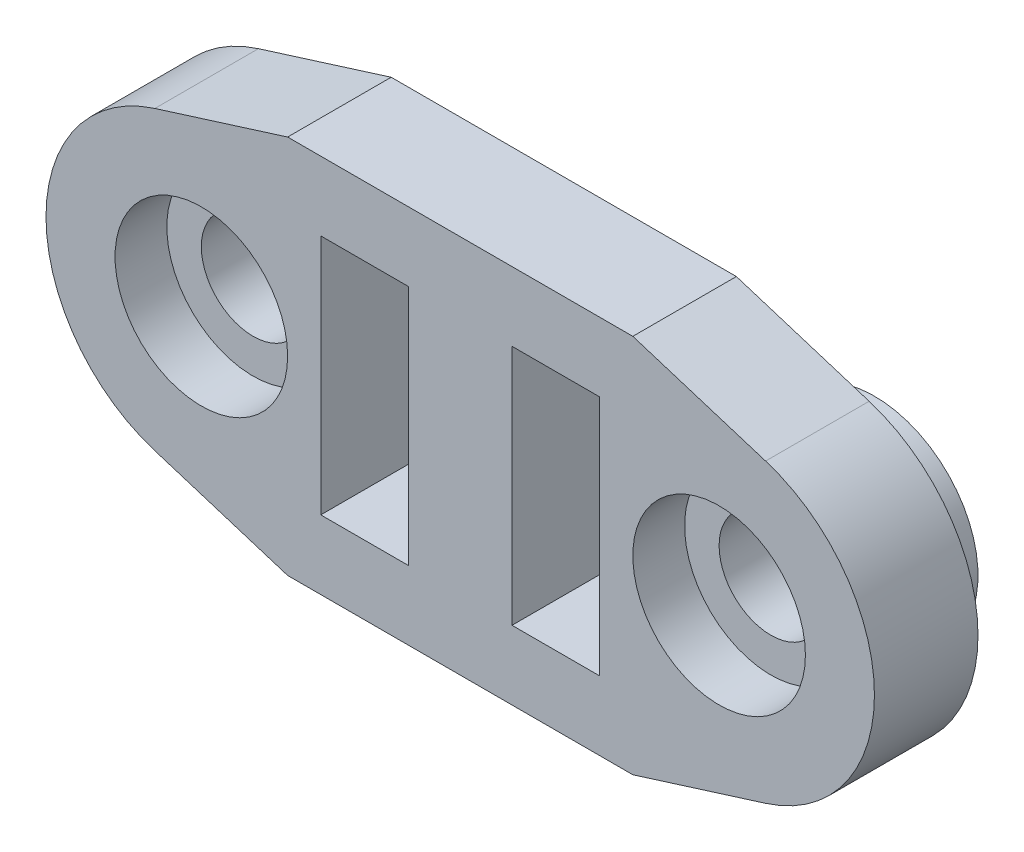
ISO-10303-21;
HEADER;
FILE_DESCRIPTION(('STEP AP214'),'2;1');
FILE_NAME('part.step','',(''),(''),'','','');
FILE_SCHEMA(('AUTOMOTIVE_DESIGN { 1 0 10303 214 1 1 1 1 }'));
ENDSEC;
DATA;
#1=APPLICATION_CONTEXT('core data for automotive mechanical design processes');
#2=APPLICATION_PROTOCOL_DEFINITION('international standard','automotive_design',2000,#1);
#3=PRODUCT_CONTEXT('',#1,'mechanical');
#4=PRODUCT('Part','Part','',(#3));
#5=PRODUCT_RELATED_PRODUCT_CATEGORY('part','',(#4));
#6=PRODUCT_DEFINITION_FORMATION('','',#4);
#7=PRODUCT_DEFINITION_CONTEXT('part definition',#1,'design');
#8=PRODUCT_DEFINITION('design','',#6,#7);
#9=PRODUCT_DEFINITION_SHAPE('','',#8);
#10=(LENGTH_UNIT() NAMED_UNIT(*) SI_UNIT(.MILLI.,.METRE.));
#11=(NAMED_UNIT(*) PLANE_ANGLE_UNIT() SI_UNIT($,.RADIAN.));
#12=(NAMED_UNIT(*) SI_UNIT($,.STERADIAN.) SOLID_ANGLE_UNIT());
#13=UNCERTAINTY_MEASURE_WITH_UNIT(LENGTH_MEASURE(1.E-05),#10,'distance_accuracy_value','');
#14=(GEOMETRIC_REPRESENTATION_CONTEXT(3) GLOBAL_UNCERTAINTY_ASSIGNED_CONTEXT((#13)) GLOBAL_UNIT_ASSIGNED_CONTEXT((#10,
#11,#12)) REPRESENTATION_CONTEXT('',''));
#15=CARTESIAN_POINT('',(0.,0.,0.));
#16=DIRECTION('',(0.,0.,1.));
#17=DIRECTION('',(1.,0.,0.));
#18=AXIS2_PLACEMENT_3D('',#15,#16,#17);
#19=CARTESIAN_POINT('',(7.5,0.,1.5));
#20=DIRECTION('',(0.,0.,-1.));
#21=DIRECTION('',(-1.,0.,0.));
#22=AXIS2_PLACEMENT_3D('',#19,#20,#21);
#23=CYLINDRICAL_SURFACE('',#22,1.5);
#24=CARTESIAN_POINT('',(7.5,0.,-3.));
#25=DIRECTION('',(0.,0.,-1.));
#26=DIRECTION('',(-1.,0.,0.));
#27=AXIS2_PLACEMENT_3D('',#24,#25,#26);
#28=CIRCLE('',#27,1.5);
#29=CARTESIAN_POINT('',(6.,0.,-3.));
#30=VERTEX_POINT('',#29);
#31=EDGE_CURVE('E277',#30,#30,#28,.T.);
#32=ORIENTED_EDGE('',*,*,#31,.T.);
#33=EDGE_LOOP('',(#32));
#34=FACE_BOUND('',#33,.T.);
#35=CARTESIAN_POINT('',(7.5,0.,0.));
#36=DIRECTION('',(0.,0.,1.));
#37=DIRECTION('',(1.,0.,0.));
#38=AXIS2_PLACEMENT_3D('',#35,#36,#37);
#39=CIRCLE('',#38,1.5);
#40=CARTESIAN_POINT('',(9.,0.,0.));
#41=VERTEX_POINT('',#40);
#42=EDGE_CURVE('E49',#41,#41,#39,.T.);
#43=ORIENTED_EDGE('',*,*,#42,.T.);
#44=EDGE_LOOP('',(#43));
#45=FACE_BOUND('',#44,.T.);
#46=ADVANCED_FACE('F45',(#34,#45),#23,.F.);
#47=CARTESIAN_POINT('',(-7.5,0.,1.5));
#48=DIRECTION('',(0.,0.,-1.));
#49=DIRECTION('',(-1.,0.,0.));
#50=AXIS2_PLACEMENT_3D('',#47,#48,#49);
#51=CYLINDRICAL_SURFACE('',#50,1.5);
#52=CARTESIAN_POINT('',(-7.5,0.,-3.));
#53=DIRECTION('',(0.,0.,-1.));
#54=DIRECTION('',(-1.,0.,0.));
#55=AXIS2_PLACEMENT_3D('',#52,#53,#54);
#56=CIRCLE('',#55,1.5);
#57=CARTESIAN_POINT('',(-9.,0.,-3.));
#58=VERTEX_POINT('',#57);
#59=EDGE_CURVE('E269',#58,#58,#56,.T.);
#60=ORIENTED_EDGE('',*,*,#59,.T.);
#61=EDGE_LOOP('',(#60));
#62=FACE_BOUND('',#61,.T.);
#63=CARTESIAN_POINT('',(-7.5,0.,0.));
#64=DIRECTION('',(0.,0.,1.));
#65=DIRECTION('',(1.,0.,0.));
#66=AXIS2_PLACEMENT_3D('',#63,#64,#65);
#67=CIRCLE('',#66,1.5);
#68=CARTESIAN_POINT('',(-6.,0.,0.));
#69=VERTEX_POINT('',#68);
#70=EDGE_CURVE('E253',#69,#69,#67,.T.);
#71=ORIENTED_EDGE('',*,*,#70,.T.);
#72=EDGE_LOOP('',(#71));
#73=FACE_BOUND('',#72,.T.);
#74=ADVANCED_FACE('F432',(#62,#73),#51,.F.);
#75=CARTESIAN_POINT('',(7.5,0.,-1.5));
#76=DIRECTION('',(0.,0.,-1.));
#77=DIRECTION('',(-1.,0.,0.));
#78=AXIS2_PLACEMENT_3D('',#75,#76,#77);
#79=PLANE('',#78);
#80=DIRECTION('',(0.,-1.,0.));
#81=VECTOR('',#80,1.);
#82=CARTESIAN_POINT('',(-1.5,0.,-1.5));
#83=LINE('',#82,#81);
#84=CARTESIAN_POINT('',(-1.5,3.5,-1.5));
#85=VERTEX_POINT('',#84);
#86=CARTESIAN_POINT('',(-1.5,-3.5,-1.5));
#87=VERTEX_POINT('',#86);
#88=EDGE_CURVE('E245',#85,#87,#83,.T.);
#89=ORIENTED_EDGE('',*,*,#88,.F.);
#90=DIRECTION('',(1.,0.,0.));
#91=VECTOR('',#90,1.);
#92=CARTESIAN_POINT('',(7.5,3.5,-1.5));
#93=LINE('',#92,#91);
#94=CARTESIAN_POINT('',(-4.04,3.5,-1.5));
#95=VERTEX_POINT('',#94);
#96=EDGE_CURVE('E237',#95,#85,#93,.T.);
#97=ORIENTED_EDGE('',*,*,#96,.F.);
#98=DIRECTION('',(0.,1.,0.));
#99=VECTOR('',#98,1.);
#100=CARTESIAN_POINT('',(-4.04,0.,-1.5));
#101=LINE('',#100,#99);
#102=CARTESIAN_POINT('',(-4.04,-3.5,-1.5));
#103=VERTEX_POINT('',#102);
#104=EDGE_CURVE('E166',#103,#95,#101,.T.);
#105=ORIENTED_EDGE('',*,*,#104,.F.);
#106=DIRECTION('',(-1.,0.,0.));
#107=VECTOR('',#106,1.);
#108=CARTESIAN_POINT('',(7.5,-3.5,-1.5));
#109=LINE('',#108,#107);
#110=EDGE_CURVE('E242',#87,#103,#109,.T.);
#111=ORIENTED_EDGE('',*,*,#110,.F.);
#112=EDGE_LOOP('',(#89,#97,#105,#111));
#113=FACE_BOUND('',#112,.T.);
#114=DIRECTION('',(0.,-1.,0.));
#115=VECTOR('',#114,1.);
#116=CARTESIAN_POINT('',(4.04,0.,-1.5));
#117=LINE('',#116,#115);
#118=CARTESIAN_POINT('',(4.04,3.5,-1.5));
#119=VERTEX_POINT('',#118);
#120=CARTESIAN_POINT('',(4.04,-3.5,-1.5));
#121=VERTEX_POINT('',#120);
#122=EDGE_CURVE('E234',#119,#121,#117,.T.);
#123=ORIENTED_EDGE('',*,*,#122,.F.);
#124=DIRECTION('',(1.,0.,0.));
#125=VECTOR('',#124,1.);
#126=CARTESIAN_POINT('',(7.5,3.5,-1.5));
#127=LINE('',#126,#125);
#128=CARTESIAN_POINT('',(1.5,3.5,-1.5));
#129=VERTEX_POINT('',#128);
#130=EDGE_CURVE('E195',#129,#119,#127,.T.);
#131=ORIENTED_EDGE('',*,*,#130,.F.);
#132=DIRECTION('',(0.,1.,0.));
#133=VECTOR('',#132,1.);
#134=CARTESIAN_POINT('',(1.5,0.,-1.5));
#135=LINE('',#134,#133);
#136=CARTESIAN_POINT('',(1.5,-3.5,-1.5));
#137=VERTEX_POINT('',#136);
#138=EDGE_CURVE('E228',#137,#129,#135,.T.);
#139=ORIENTED_EDGE('',*,*,#138,.F.);
#140=DIRECTION('',(-1.,0.,0.));
#141=VECTOR('',#140,1.);
#142=CARTESIAN_POINT('',(7.5,-3.5,-1.5));
#143=LINE('',#142,#141);
#144=EDGE_CURVE('E231',#121,#137,#143,.T.);
#145=ORIENTED_EDGE('',*,*,#144,.F.);
#146=EDGE_LOOP('',(#123,#131,#139,#145));
#147=FACE_BOUND('',#146,.T.);
#148=CARTESIAN_POINT('',(7.5,0.,-1.5));
#149=DIRECTION('',(0.,0.,-1.));
#150=DIRECTION('',(-1.,0.,0.));
#151=AXIS2_PLACEMENT_3D('',#148,#149,#150);
#152=CIRCLE('',#151,3.);
#153=CARTESIAN_POINT('',(4.5,0.,-1.5));
#154=VERTEX_POINT('',#153);
#155=EDGE_CURVE('E281',#154,#154,#152,.T.);
#156=ORIENTED_EDGE('',*,*,#155,.F.);
#157=EDGE_LOOP('',(#156));
#158=FACE_BOUND('',#157,.T.);
#159=DIRECTION('',(-0.954186909188307,-0.299211200214274,0.));
#160=VECTOR('',#159,1.);
#161=CARTESIAN_POINT('',(-8.84645040096423,4.29384109134738,-1.5));
#162=LINE('',#161,#160);
#163=CARTESIAN_POINT('',(-5.,5.5,-1.5));
#164=VERTEX_POINT('',#163);
#165=CARTESIAN_POINT('',(-8.84645040096424,4.29384109134738,-1.5));
#166=VERTEX_POINT('',#165);
#167=EDGE_CURVE('E286',#164,#166,#162,.T.);
#168=ORIENTED_EDGE('',*,*,#167,.F.);
#169=DIRECTION('',(-1.,0.,0.));
#170=VECTOR('',#169,1.);
#171=CARTESIAN_POINT('',(-5.,5.5,-1.5));
#172=LINE('',#171,#170);
#173=CARTESIAN_POINT('',(5.,5.5,-1.5));
#174=VERTEX_POINT('',#173);
#175=EDGE_CURVE('E295',#174,#164,#172,.T.);
#176=ORIENTED_EDGE('',*,*,#175,.F.);
#177=DIRECTION('',(-0.954186909188307,0.299211200214274,0.));
#178=VECTOR('',#177,1.);
#179=CARTESIAN_POINT('',(5.,5.5,-1.5));
#180=LINE('',#179,#178);
#181=CARTESIAN_POINT('',(8.84645040096424,4.29384109134738,-1.5));
#182=VERTEX_POINT('',#181);
#183=EDGE_CURVE('E335',#182,#174,#180,.T.);
#184=ORIENTED_EDGE('',*,*,#183,.F.);
#185=CARTESIAN_POINT('',(7.5,0.,-1.5));
#186=DIRECTION('',(0.,0.,1.));
#187=DIRECTION('',(-1.,0.,0.));
#188=AXIS2_PLACEMENT_3D('',#185,#186,#187);
#189=CIRCLE('',#188,4.5);
#190=CARTESIAN_POINT('',(8.84645040096423,-4.29384109134738,-1.5));
#191=VERTEX_POINT('',#190);
#192=EDGE_CURVE('E332',#191,#182,#189,.T.);
#193=ORIENTED_EDGE('',*,*,#192,.F.);
#194=DIRECTION('',(0.954186909188307,0.299211200214274,0.));
#195=VECTOR('',#194,1.);
#196=CARTESIAN_POINT('',(8.84645040096424,-4.29384109134738,-1.5));
#197=LINE('',#196,#195);
#198=CARTESIAN_POINT('',(5.,-5.5,-1.5));
#199=VERTEX_POINT('',#198);
#200=EDGE_CURVE('E329',#199,#191,#197,.T.);
#201=ORIENTED_EDGE('',*,*,#200,.F.);
#202=DIRECTION('',(1.,0.,0.));
#203=VECTOR('',#202,1.);
#204=CARTESIAN_POINT('',(5.,-5.5,-1.5));
#205=LINE('',#204,#203);
#206=CARTESIAN_POINT('',(-5.,-5.5,-1.5));
#207=VERTEX_POINT('',#206);
#208=EDGE_CURVE('E326',#207,#199,#205,.T.);
#209=ORIENTED_EDGE('',*,*,#208,.F.);
#210=DIRECTION('',(0.954186909188307,-0.299211200214274,0.));
#211=VECTOR('',#210,1.);
#212=CARTESIAN_POINT('',(-5.,-5.5,-1.5));
#213=LINE('',#212,#211);
#214=CARTESIAN_POINT('',(-8.84645040096423,-4.29384109134738,-1.5));
#215=VERTEX_POINT('',#214);
#216=EDGE_CURVE('E323',#215,#207,#213,.T.);
#217=ORIENTED_EDGE('',*,*,#216,.F.);
#218=CARTESIAN_POINT('',(-7.5,0.,-1.5));
#219=DIRECTION('',(0.,0.,1.));
#220=DIRECTION('',(-1.,0.,0.));
#221=AXIS2_PLACEMENT_3D('',#218,#219,#220);
#222=CIRCLE('',#221,4.5);
#223=EDGE_CURVE('E320',#166,#215,#222,.T.);
#224=ORIENTED_EDGE('',*,*,#223,.F.);
#225=EDGE_LOOP('',(#168,#176,#184,#193,#201,#209,#217,#224));
#226=FACE_BOUND('',#225,.T.);
#227=CARTESIAN_POINT('',(-7.5,0.,-1.5));
#228=DIRECTION('',(0.,0.,-1.));
#229=DIRECTION('',(-1.,0.,0.));
#230=AXIS2_PLACEMENT_3D('',#227,#228,#229);
#231=CIRCLE('',#230,3.);
#232=CARTESIAN_POINT('',(-10.5,0.,-1.5));
#233=VERTEX_POINT('',#232);
#234=EDGE_CURVE('E265',#233,#233,#231,.T.);
#235=ORIENTED_EDGE('',*,*,#234,.F.);
#236=EDGE_LOOP('',(#235));
#237=FACE_BOUND('',#236,.T.);
#238=ADVANCED_FACE('F390',(#113,#147,#158,#226,#237),#79,.T.);
#239=CARTESIAN_POINT('',(7.5,0.,1.5));
#240=DIRECTION('',(0.,0.,-1.));
#241=DIRECTION('',(-1.,0.,0.));
#242=AXIS2_PLACEMENT_3D('',#239,#240,#241);
#243=PLANE('',#242);
#244=DIRECTION('',(-1.,0.,0.));
#245=VECTOR('',#244,1.);
#246=CARTESIAN_POINT('',(-4.04,3.5,1.5));
#247=LINE('',#246,#245);
#248=CARTESIAN_POINT('',(-1.5,3.5,1.5));
#249=VERTEX_POINT('',#248);
#250=CARTESIAN_POINT('',(-4.04,3.5,1.5));
#251=VERTEX_POINT('',#250);
#252=EDGE_CURVE('E174',#249,#251,#247,.T.);
#253=ORIENTED_EDGE('',*,*,#252,.F.);
#254=DIRECTION('',(0.,1.,0.));
#255=VECTOR('',#254,1.);
#256=CARTESIAN_POINT('',(-1.5,-3.5,1.5));
#257=LINE('',#256,#255);
#258=CARTESIAN_POINT('',(-1.5,-3.5,1.5));
#259=VERTEX_POINT('',#258);
#260=EDGE_CURVE('E180',#259,#249,#257,.T.);
#261=ORIENTED_EDGE('',*,*,#260,.F.);
#262=DIRECTION('',(1.,0.,0.));
#263=VECTOR('',#262,1.);
#264=CARTESIAN_POINT('',(-4.04,-3.5,1.5));
#265=LINE('',#264,#263);
#266=CARTESIAN_POINT('',(-4.04,-3.5,1.5));
#267=VERTEX_POINT('',#266);
#268=EDGE_CURVE('E185',#267,#259,#265,.T.);
#269=ORIENTED_EDGE('',*,*,#268,.F.);
#270=DIRECTION('',(0.,-1.,0.));
#271=VECTOR('',#270,1.);
#272=CARTESIAN_POINT('',(-4.04,-3.5,1.5));
#273=LINE('',#272,#271);
#274=EDGE_CURVE('E163',#251,#267,#273,.T.);
#275=ORIENTED_EDGE('',*,*,#274,.F.);
#276=EDGE_LOOP('',(#253,#261,#269,#275));
#277=FACE_BOUND('',#276,.T.);
#278=DIRECTION('',(-1.,0.,0.));
#279=VECTOR('',#278,1.);
#280=CARTESIAN_POINT('',(1.5,3.5,1.5));
#281=LINE('',#280,#279);
#282=CARTESIAN_POINT('',(4.04,3.5,1.5));
#283=VERTEX_POINT('',#282);
#284=CARTESIAN_POINT('',(1.5,3.5,1.5));
#285=VERTEX_POINT('',#284);
#286=EDGE_CURVE('E220',#283,#285,#281,.T.);
#287=ORIENTED_EDGE('',*,*,#286,.F.);
#288=DIRECTION('',(0.,1.,0.));
#289=VECTOR('',#288,1.);
#290=CARTESIAN_POINT('',(4.04,-3.5,1.5));
#291=LINE('',#290,#289);
#292=CARTESIAN_POINT('',(4.04,-3.5,1.5));
#293=VERTEX_POINT('',#292);
#294=EDGE_CURVE('E223',#293,#283,#291,.T.);
#295=ORIENTED_EDGE('',*,*,#294,.F.);
#296=DIRECTION('',(1.,0.,0.));
#297=VECTOR('',#296,1.);
#298=CARTESIAN_POINT('',(1.5,-3.5,1.5));
#299=LINE('',#298,#297);
#300=CARTESIAN_POINT('',(1.5,-3.5,1.5));
#301=VERTEX_POINT('',#300);
#302=EDGE_CURVE('E204',#301,#293,#299,.T.);
#303=ORIENTED_EDGE('',*,*,#302,.F.);
#304=DIRECTION('',(0.,-1.,0.));
#305=VECTOR('',#304,1.);
#306=CARTESIAN_POINT('',(1.5,-3.5,1.5));
#307=LINE('',#306,#305);
#308=EDGE_CURVE('E216',#285,#301,#307,.T.);
#309=ORIENTED_EDGE('',*,*,#308,.F.);
#310=EDGE_LOOP('',(#287,#295,#303,#309));
#311=FACE_BOUND('',#310,.T.);
#312=CARTESIAN_POINT('',(-7.5,0.,1.5));
#313=DIRECTION('',(0.,0.,1.));
#314=DIRECTION('',(1.,0.,0.));
#315=AXIS2_PLACEMENT_3D('',#312,#313,#314);
#316=CIRCLE('',#315,2.5);
#317=CARTESIAN_POINT('',(-5.,0.,1.5));
#318=VERTEX_POINT('',#317);
#319=EDGE_CURVE('E254',#318,#318,#316,.T.);
#320=ORIENTED_EDGE('',*,*,#319,.F.);
#321=EDGE_LOOP('',(#320));
#322=FACE_BOUND('',#321,.T.);
#323=CARTESIAN_POINT('',(7.5,0.,1.5));
#324=DIRECTION('',(0.,0.,1.));
#325=DIRECTION('',(1.,0.,0.));
#326=AXIS2_PLACEMENT_3D('',#323,#324,#325);
#327=CIRCLE('',#326,2.5);
#328=CARTESIAN_POINT('',(10.,0.,1.5));
#329=VERTEX_POINT('',#328);
#330=EDGE_CURVE('E258',#329,#329,#327,.T.);
#331=ORIENTED_EDGE('',*,*,#330,.F.);
#332=EDGE_LOOP('',(#331));
#333=FACE_BOUND('',#332,.T.);
#334=DIRECTION('',(-0.954186909188307,-0.299211200214274,0.));
#335=VECTOR('',#334,1.);
#336=CARTESIAN_POINT('',(-8.84645040096423,4.29384109134738,1.5));
#337=LINE('',#336,#335);
#338=CARTESIAN_POINT('',(-5.,5.5,1.5));
#339=VERTEX_POINT('',#338);
#340=CARTESIAN_POINT('',(-8.84645040096424,4.29384109134738,1.5));
#341=VERTEX_POINT('',#340);
#342=EDGE_CURVE('E290',#339,#341,#337,.T.);
#343=ORIENTED_EDGE('',*,*,#342,.T.);
#344=CARTESIAN_POINT('',(-7.5,0.,1.5));
#345=DIRECTION('',(0.,0.,1.));
#346=DIRECTION('',(-1.,0.,0.));
#347=AXIS2_PLACEMENT_3D('',#344,#345,#346);
#348=CIRCLE('',#347,4.5);
#349=CARTESIAN_POINT('',(-8.84645040096423,-4.29384109134738,1.5));
#350=VERTEX_POINT('',#349);
#351=EDGE_CURVE('E294',#341,#350,#348,.T.);
#352=ORIENTED_EDGE('',*,*,#351,.T.);
#353=DIRECTION('',(0.954186909188307,-0.299211200214274,0.));
#354=VECTOR('',#353,1.);
#355=CARTESIAN_POINT('',(-5.,-5.5,1.5));
#356=LINE('',#355,#354);
#357=CARTESIAN_POINT('',(-5.,-5.5,1.5));
#358=VERTEX_POINT('',#357);
#359=EDGE_CURVE('E298',#350,#358,#356,.T.);
#360=ORIENTED_EDGE('',*,*,#359,.T.);
#361=DIRECTION('',(1.,0.,0.));
#362=VECTOR('',#361,1.);
#363=CARTESIAN_POINT('',(5.,-5.5,1.5));
#364=LINE('',#363,#362);
#365=CARTESIAN_POINT('',(5.,-5.5,1.5));
#366=VERTEX_POINT('',#365);
#367=EDGE_CURVE('E301',#358,#366,#364,.T.);
#368=ORIENTED_EDGE('',*,*,#367,.T.);
#369=DIRECTION('',(0.954186909188307,0.299211200214274,0.));
#370=VECTOR('',#369,1.);
#371=CARTESIAN_POINT('',(8.84645040096424,-4.29384109134738,1.5));
#372=LINE('',#371,#370);
#373=CARTESIAN_POINT('',(8.84645040096423,-4.29384109134738,1.5));
#374=VERTEX_POINT('',#373);
#375=EDGE_CURVE('E304',#366,#374,#372,.T.);
#376=ORIENTED_EDGE('',*,*,#375,.T.);
#377=CARTESIAN_POINT('',(7.5,0.,1.5));
#378=DIRECTION('',(0.,0.,1.));
#379=DIRECTION('',(-1.,0.,0.));
#380=AXIS2_PLACEMENT_3D('',#377,#378,#379);
#381=CIRCLE('',#380,4.5);
#382=CARTESIAN_POINT('',(8.84645040096424,4.29384109134738,1.5));
#383=VERTEX_POINT('',#382);
#384=EDGE_CURVE('E307',#374,#383,#381,.T.);
#385=ORIENTED_EDGE('',*,*,#384,.T.);
#386=DIRECTION('',(-0.954186909188307,0.299211200214274,0.));
#387=VECTOR('',#386,1.);
#388=CARTESIAN_POINT('',(5.,5.5,1.5));
#389=LINE('',#388,#387);
#390=CARTESIAN_POINT('',(5.,5.5,1.5));
#391=VERTEX_POINT('',#390);
#392=EDGE_CURVE('E310',#383,#391,#389,.T.);
#393=ORIENTED_EDGE('',*,*,#392,.T.);
#394=DIRECTION('',(-1.,0.,0.));
#395=VECTOR('',#394,1.);
#396=CARTESIAN_POINT('',(-5.,5.5,1.5));
#397=LINE('',#396,#395);
#398=EDGE_CURVE('E313',#391,#339,#397,.T.);
#399=ORIENTED_EDGE('',*,*,#398,.T.);
#400=EDGE_LOOP('',(#343,#352,#360,#368,#376,#385,#393,#399));
#401=FACE_BOUND('',#400,.T.);
#402=ADVANCED_FACE('F182',(#277,#311,#322,#333,#401),#243,.F.);
#403=CARTESIAN_POINT('',(-8.84645040096423,4.29384109134738,1.5));
#404=DIRECTION('',(0.299211200214274,-0.954186909188306,0.));
#405=DIRECTION('',(0.954186909188307,0.299211200214274,0.));
#406=AXIS2_PLACEMENT_3D('',#403,#404,#405);
#407=PLANE('',#406);
#408=ORIENTED_EDGE('',*,*,#167,.T.);
#409=DIRECTION('',(0.,0.,-1.));
#410=VECTOR('',#409,1.);
#411=CARTESIAN_POINT('',(-8.84645040096424,4.29384109134738,1.5));
#412=LINE('',#411,#410);
#413=EDGE_CURVE('E11',#341,#166,#412,.T.);
#414=ORIENTED_EDGE('',*,*,#413,.F.);
#415=ORIENTED_EDGE('',*,*,#342,.F.);
#416=DIRECTION('',(0.,0.,-1.));
#417=VECTOR('',#416,1.);
#418=CARTESIAN_POINT('',(-5.,5.5,1.5));
#419=LINE('',#418,#417);
#420=EDGE_CURVE('E316',#339,#164,#419,.T.);
#421=ORIENTED_EDGE('',*,*,#420,.T.);
#422=EDGE_LOOP('',(#408,#414,#415,#421));
#423=FACE_BOUND('',#422,.T.);
#424=ADVANCED_FACE('F47',(#423),#407,.F.);
#425=CARTESIAN_POINT('',(-7.5,0.,1.5));
#426=DIRECTION('',(0.,0.,-1.));
#427=DIRECTION('',(-1.,0.,0.));
#428=AXIS2_PLACEMENT_3D('',#425,#426,#427);
#429=CYLINDRICAL_SURFACE('',#428,4.5);
#430=ORIENTED_EDGE('',*,*,#223,.T.);
#431=DIRECTION('',(0.,0.,-1.));
#432=VECTOR('',#431,1.);
#433=CARTESIAN_POINT('',(-8.84645040096423,-4.29384109134738,1.5));
#434=LINE('',#433,#432);
#435=EDGE_CURVE('E55',#350,#215,#434,.T.);
#436=ORIENTED_EDGE('',*,*,#435,.F.);
#437=ORIENTED_EDGE('',*,*,#351,.F.);
#438=ORIENTED_EDGE('',*,*,#413,.T.);
#439=EDGE_LOOP('',(#430,#436,#437,#438));
#440=FACE_BOUND('',#439,.T.);
#441=ADVANCED_FACE('F400',(#440),#429,.T.);
#442=CARTESIAN_POINT('',(-5.,-5.5,1.5));
#443=DIRECTION('',(0.299211200214274,0.954186909188306,0.));
#444=DIRECTION('',(-0.954186909188307,0.299211200214274,0.));
#445=AXIS2_PLACEMENT_3D('',#442,#443,#444);
#446=PLANE('',#445);
#447=ORIENTED_EDGE('',*,*,#216,.T.);
#448=DIRECTION('',(0.,0.,-1.));
#449=VECTOR('',#448,1.);
#450=CARTESIAN_POINT('',(-5.,-5.5,1.5));
#451=LINE('',#450,#449);
#452=EDGE_CURVE('E359',#358,#207,#451,.T.);
#453=ORIENTED_EDGE('',*,*,#452,.F.);
#454=ORIENTED_EDGE('',*,*,#359,.F.);
#455=ORIENTED_EDGE('',*,*,#435,.T.);
#456=EDGE_LOOP('',(#447,#453,#454,#455));
#457=FACE_BOUND('',#456,.T.);
#458=ADVANCED_FACE('F405',(#457),#446,.F.);
#459=CARTESIAN_POINT('',(5.,-5.5,1.5));
#460=DIRECTION('',(0.,1.,0.));
#461=DIRECTION('',(0.,0.,1.));
#462=AXIS2_PLACEMENT_3D('',#459,#460,#461);
#463=PLANE('',#462);
#464=ORIENTED_EDGE('',*,*,#208,.T.);
#465=DIRECTION('',(0.,0.,-1.));
#466=VECTOR('',#465,1.);
#467=CARTESIAN_POINT('',(5.,-5.5,1.5));
#468=LINE('',#467,#466);
#469=EDGE_CURVE('E355',#366,#199,#468,.T.);
#470=ORIENTED_EDGE('',*,*,#469,.F.);
#471=ORIENTED_EDGE('',*,*,#367,.F.);
#472=ORIENTED_EDGE('',*,*,#452,.T.);
#473=EDGE_LOOP('',(#464,#470,#471,#472));
#474=FACE_BOUND('',#473,.T.);
#475=ADVANCED_FACE('F411',(#474),#463,.F.);
#476=CARTESIAN_POINT('',(8.84645040096424,-4.29384109134738,1.5));
#477=DIRECTION('',(-0.299211200214274,0.954186909188307,0.));
#478=DIRECTION('',(-0.954186909188307,-0.299211200214274,0.));
#479=AXIS2_PLACEMENT_3D('',#476,#477,#478);
#480=PLANE('',#479);
#481=ORIENTED_EDGE('',*,*,#200,.T.);
#482=DIRECTION('',(0.,0.,-1.));
#483=VECTOR('',#482,1.);
#484=CARTESIAN_POINT('',(8.84645040096423,-4.29384109134738,1.5));
#485=LINE('',#484,#483);
#486=EDGE_CURVE('E351',#374,#191,#485,.T.);
#487=ORIENTED_EDGE('',*,*,#486,.F.);
#488=ORIENTED_EDGE('',*,*,#375,.F.);
#489=ORIENTED_EDGE('',*,*,#469,.T.);
#490=EDGE_LOOP('',(#481,#487,#488,#489));
#491=FACE_BOUND('',#490,.T.);
#492=ADVANCED_FACE('F415',(#491),#480,.F.);
#493=CARTESIAN_POINT('',(7.5,0.,1.5));
#494=DIRECTION('',(0.,0.,-1.));
#495=DIRECTION('',(-1.,0.,0.));
#496=AXIS2_PLACEMENT_3D('',#493,#494,#495);
#497=CYLINDRICAL_SURFACE('',#496,4.5);
#498=ORIENTED_EDGE('',*,*,#192,.T.);
#499=DIRECTION('',(0.,0.,-1.));
#500=VECTOR('',#499,1.);
#501=CARTESIAN_POINT('',(8.84645040096424,4.29384109134738,1.5));
#502=LINE('',#501,#500);
#503=EDGE_CURVE('E347',#383,#182,#502,.T.);
#504=ORIENTED_EDGE('',*,*,#503,.F.);
#505=ORIENTED_EDGE('',*,*,#384,.F.);
#506=ORIENTED_EDGE('',*,*,#486,.T.);
#507=EDGE_LOOP('',(#498,#504,#505,#506));
#508=FACE_BOUND('',#507,.T.);
#509=ADVANCED_FACE('F420',(#508),#497,.T.);
#510=CARTESIAN_POINT('',(5.,5.5,1.5));
#511=DIRECTION('',(-0.299211200214274,-0.954186909188307,0.));
#512=DIRECTION('',(0.954186909188307,-0.299211200214274,0.));
#513=AXIS2_PLACEMENT_3D('',#510,#511,#512);
#514=PLANE('',#513);
#515=ORIENTED_EDGE('',*,*,#183,.T.);
#516=DIRECTION('',(0.,0.,-1.));
#517=VECTOR('',#516,1.);
#518=CARTESIAN_POINT('',(5.,5.5,1.5));
#519=LINE('',#518,#517);
#520=EDGE_CURVE('E343',#391,#174,#519,.T.);
#521=ORIENTED_EDGE('',*,*,#520,.F.);
#522=ORIENTED_EDGE('',*,*,#392,.F.);
#523=ORIENTED_EDGE('',*,*,#503,.T.);
#524=EDGE_LOOP('',(#515,#521,#522,#523));
#525=FACE_BOUND('',#524,.T.);
#526=ADVANCED_FACE('F424',(#525),#514,.F.);
#527=CARTESIAN_POINT('',(-5.,5.5,1.5));
#528=DIRECTION('',(0.,-1.,0.));
#529=DIRECTION('',(0.,0.,-1.));
#530=AXIS2_PLACEMENT_3D('',#527,#528,#529);
#531=PLANE('',#530);
#532=ORIENTED_EDGE('',*,*,#175,.T.);
#533=ORIENTED_EDGE('',*,*,#420,.F.);
#534=ORIENTED_EDGE('',*,*,#398,.F.);
#535=ORIENTED_EDGE('',*,*,#520,.T.);
#536=EDGE_LOOP('',(#532,#533,#534,#535));
#537=FACE_BOUND('',#536,.T.);
#538=ADVANCED_FACE('F428',(#537),#531,.F.);
#539=CARTESIAN_POINT('',(7.5,0.,-3.));
#540=DIRECTION('',(0.,0.,-1.));
#541=DIRECTION('',(-1.,0.,0.));
#542=AXIS2_PLACEMENT_3D('',#539,#540,#541);
#543=PLANE('',#542);
#544=CARTESIAN_POINT('',(7.5,0.,-3.));
#545=DIRECTION('',(0.,0.,-1.));
#546=DIRECTION('',(-1.,0.,0.));
#547=AXIS2_PLACEMENT_3D('',#544,#545,#546);
#548=CIRCLE('',#547,3.);
#549=CARTESIAN_POINT('',(4.5,0.,-3.));
#550=VERTEX_POINT('',#549);
#551=EDGE_CURVE('E282',#550,#550,#548,.T.);
#552=ORIENTED_EDGE('',*,*,#551,.T.);
#553=EDGE_LOOP('',(#552));
#554=FACE_BOUND('',#553,.T.);
#555=ORIENTED_EDGE('',*,*,#31,.F.);
#556=EDGE_LOOP('',(#555));
#557=FACE_BOUND('',#556,.T.);
#558=ADVANCED_FACE('F465',(#554,#557),#543,.T.);
#559=CARTESIAN_POINT('',(7.5,0.,-3.));
#560=DIRECTION('',(0.,0.,1.));
#561=DIRECTION('',(1.,0.,0.));
#562=AXIS2_PLACEMENT_3D('',#559,#560,#561);
#563=CYLINDRICAL_SURFACE('',#562,3.);
#564=ORIENTED_EDGE('',*,*,#551,.F.);
#565=EDGE_LOOP('',(#564));
#566=FACE_BOUND('',#565,.T.);
#567=ORIENTED_EDGE('',*,*,#155,.T.);
#568=EDGE_LOOP('',(#567));
#569=FACE_BOUND('',#568,.T.);
#570=ADVANCED_FACE('F450',(#566,#569),#563,.T.);
#571=CARTESIAN_POINT('',(-7.5,0.,-3.));
#572=DIRECTION('',(0.,0.,-1.));
#573=DIRECTION('',(-1.,0.,0.));
#574=AXIS2_PLACEMENT_3D('',#571,#572,#573);
#575=PLANE('',#574);
#576=CARTESIAN_POINT('',(-7.5,0.,-3.));
#577=DIRECTION('',(0.,0.,-1.));
#578=DIRECTION('',(-1.,0.,0.));
#579=AXIS2_PLACEMENT_3D('',#576,#577,#578);
#580=CIRCLE('',#579,3.);
#581=CARTESIAN_POINT('',(-10.5,0.,-3.));
#582=VERTEX_POINT('',#581);
#583=EDGE_CURVE('E270',#582,#582,#580,.T.);
#584=ORIENTED_EDGE('',*,*,#583,.T.);
#585=EDGE_LOOP('',(#584));
#586=FACE_BOUND('',#585,.T.);
#587=ORIENTED_EDGE('',*,*,#59,.F.);
#588=EDGE_LOOP('',(#587));
#589=FACE_BOUND('',#588,.T.);
#590=ADVANCED_FACE('F440',(#586,#589),#575,.T.);
#591=CARTESIAN_POINT('',(-7.5,0.,-3.));
#592=DIRECTION('',(0.,0.,1.));
#593=DIRECTION('',(1.,0.,0.));
#594=AXIS2_PLACEMENT_3D('',#591,#592,#593);
#595=CYLINDRICAL_SURFACE('',#594,3.);
#596=ORIENTED_EDGE('',*,*,#583,.F.);
#597=EDGE_LOOP('',(#596));
#598=FACE_BOUND('',#597,.T.);
#599=ORIENTED_EDGE('',*,*,#234,.T.);
#600=EDGE_LOOP('',(#599));
#601=FACE_BOUND('',#600,.T.);
#602=ADVANCED_FACE('F437',(#598,#601),#595,.T.);
#603=CARTESIAN_POINT('',(-7.5,0.,0.));
#604=DIRECTION('',(0.,0.,1.));
#605=DIRECTION('',(1.,0.,0.));
#606=AXIS2_PLACEMENT_3D('',#603,#604,#605);
#607=CYLINDRICAL_SURFACE('',#606,2.5);
#608=CARTESIAN_POINT('',(-7.5,0.,0.));
#609=DIRECTION('',(0.,0.,1.));
#610=DIRECTION('',(1.,0.,0.));
#611=AXIS2_PLACEMENT_3D('',#608,#609,#610);
#612=CIRCLE('',#611,2.5);
#613=CARTESIAN_POINT('',(-5.,0.,0.));
#614=VERTEX_POINT('',#613);
#615=EDGE_CURVE('E249',#614,#614,#612,.T.);
#616=ORIENTED_EDGE('',*,*,#615,.F.);
#617=EDGE_LOOP('',(#616));
#618=FACE_BOUND('',#617,.T.);
#619=ORIENTED_EDGE('',*,*,#319,.T.);
#620=EDGE_LOOP('',(#619));
#621=FACE_BOUND('',#620,.T.);
#622=ADVANCED_FACE('F439',(#618,#621),#607,.F.);
#623=CARTESIAN_POINT('',(-7.5,0.,0.));
#624=DIRECTION('',(0.,0.,1.));
#625=DIRECTION('',(1.,0.,0.));
#626=AXIS2_PLACEMENT_3D('',#623,#624,#625);
#627=PLANE('',#626);
#628=ORIENTED_EDGE('',*,*,#70,.F.);
#629=EDGE_LOOP('',(#628));
#630=FACE_BOUND('',#629,.T.);
#631=ORIENTED_EDGE('',*,*,#615,.T.);
#632=EDGE_LOOP('',(#631));
#633=FACE_BOUND('',#632,.T.);
#634=ADVANCED_FACE('F384',(#630,#633),#627,.T.);
#635=CARTESIAN_POINT('',(7.5,0.,0.));
#636=DIRECTION('',(0.,0.,1.));
#637=DIRECTION('',(1.,0.,0.));
#638=AXIS2_PLACEMENT_3D('',#635,#636,#637);
#639=CYLINDRICAL_SURFACE('',#638,2.5);
#640=CARTESIAN_POINT('',(7.5,0.,0.));
#641=DIRECTION('',(0.,0.,1.));
#642=DIRECTION('',(1.,0.,0.));
#643=AXIS2_PLACEMENT_3D('',#640,#641,#642);
#644=CIRCLE('',#643,2.5);
#645=CARTESIAN_POINT('',(10.,0.,0.));
#646=VERTEX_POINT('',#645);
#647=EDGE_CURVE('E248',#646,#646,#644,.T.);
#648=ORIENTED_EDGE('',*,*,#647,.F.);
#649=EDGE_LOOP('',(#648));
#650=FACE_BOUND('',#649,.T.);
#651=ORIENTED_EDGE('',*,*,#330,.T.);
#652=EDGE_LOOP('',(#651));
#653=FACE_BOUND('',#652,.T.);
#654=ADVANCED_FACE('F378',(#650,#653),#639,.F.);
#655=CARTESIAN_POINT('',(7.5,0.,0.));
#656=DIRECTION('',(0.,0.,1.));
#657=DIRECTION('',(1.,0.,0.));
#658=AXIS2_PLACEMENT_3D('',#655,#656,#657);
#659=PLANE('',#658);
#660=ORIENTED_EDGE('',*,*,#42,.F.);
#661=EDGE_LOOP('',(#660));
#662=FACE_BOUND('',#661,.T.);
#663=ORIENTED_EDGE('',*,*,#647,.T.);
#664=EDGE_LOOP('',(#663));
#665=FACE_BOUND('',#664,.T.);
#666=ADVANCED_FACE('F374',(#662,#665),#659,.T.);
#667=CARTESIAN_POINT('',(4.04,-3.5,-3.));
#668=DIRECTION('',(1.,0.,0.));
#669=DIRECTION('',(0.,0.,-1.));
#670=AXIS2_PLACEMENT_3D('',#667,#668,#669);
#671=PLANE('',#670);
#672=ORIENTED_EDGE('',*,*,#122,.T.);
#673=DIRECTION('',(0.,0.,1.));
#674=VECTOR('',#673,1.);
#675=CARTESIAN_POINT('',(4.04,-3.5,-3.));
#676=LINE('',#675,#674);
#677=EDGE_CURVE('E210',#121,#293,#676,.T.);
#678=ORIENTED_EDGE('',*,*,#677,.T.);
#679=ORIENTED_EDGE('',*,*,#294,.T.);
#680=DIRECTION('',(0.,0.,1.));
#681=VECTOR('',#680,1.);
#682=CARTESIAN_POINT('',(4.04,3.5,-3.));
#683=LINE('',#682,#681);
#684=EDGE_CURVE('E200',#119,#283,#683,.T.);
#685=ORIENTED_EDGE('',*,*,#684,.F.);
#686=EDGE_LOOP('',(#672,#678,#679,#685));
#687=FACE_BOUND('',#686,.T.);
#688=ADVANCED_FACE('F377',(#687),#671,.F.);
#689=CARTESIAN_POINT('',(1.5,-3.5,-3.));
#690=DIRECTION('',(0.,-1.,0.));
#691=DIRECTION('',(0.,0.,-1.));
#692=AXIS2_PLACEMENT_3D('',#689,#690,#691);
#693=PLANE('',#692);
#694=ORIENTED_EDGE('',*,*,#144,.T.);
#695=DIRECTION('',(0.,0.,1.));
#696=VECTOR('',#695,1.);
#697=CARTESIAN_POINT('',(1.5,-3.5,-3.));
#698=LINE('',#697,#696);
#699=EDGE_CURVE('E207',#137,#301,#698,.T.);
#700=ORIENTED_EDGE('',*,*,#699,.T.);
#701=ORIENTED_EDGE('',*,*,#302,.T.);
#702=ORIENTED_EDGE('',*,*,#677,.F.);
#703=EDGE_LOOP('',(#694,#700,#701,#702));
#704=FACE_BOUND('',#703,.T.);
#705=ADVANCED_FACE('F610',(#704),#693,.F.);
#706=CARTESIAN_POINT('',(1.5,-3.5,-3.));
#707=DIRECTION('',(-1.,0.,0.));
#708=DIRECTION('',(0.,0.,1.));
#709=AXIS2_PLACEMENT_3D('',#706,#707,#708);
#710=PLANE('',#709);
#711=ORIENTED_EDGE('',*,*,#138,.T.);
#712=DIRECTION('',(0.,0.,1.));
#713=VECTOR('',#712,1.);
#714=CARTESIAN_POINT('',(1.5,3.5,-3.));
#715=LINE('',#714,#713);
#716=EDGE_CURVE('E71',#129,#285,#715,.T.);
#717=ORIENTED_EDGE('',*,*,#716,.T.);
#718=ORIENTED_EDGE('',*,*,#308,.T.);
#719=ORIENTED_EDGE('',*,*,#699,.F.);
#720=EDGE_LOOP('',(#711,#717,#718,#719));
#721=FACE_BOUND('',#720,.T.);
#722=ADVANCED_FACE('F620',(#721),#710,.F.);
#723=CARTESIAN_POINT('',(1.5,3.5,-3.));
#724=DIRECTION('',(0.,1.,0.));
#725=DIRECTION('',(0.,0.,1.));
#726=AXIS2_PLACEMENT_3D('',#723,#724,#725);
#727=PLANE('',#726);
#728=ORIENTED_EDGE('',*,*,#130,.T.);
#729=ORIENTED_EDGE('',*,*,#684,.T.);
#730=ORIENTED_EDGE('',*,*,#286,.T.);
#731=ORIENTED_EDGE('',*,*,#716,.F.);
#732=EDGE_LOOP('',(#728,#729,#730,#731));
#733=FACE_BOUND('',#732,.T.);
#734=ADVANCED_FACE('F630',(#733),#727,.F.);
#735=CARTESIAN_POINT('',(-1.5,-3.5,-3.));
#736=DIRECTION('',(1.,0.,0.));
#737=DIRECTION('',(0.,0.,-1.));
#738=AXIS2_PLACEMENT_3D('',#735,#736,#737);
#739=PLANE('',#738);
#740=ORIENTED_EDGE('',*,*,#88,.T.);
#741=DIRECTION('',(0.,0.,1.));
#742=VECTOR('',#741,1.);
#743=CARTESIAN_POINT('',(-1.5,-3.5,-3.));
#744=LINE('',#743,#742);
#745=EDGE_CURVE('E192',#87,#259,#744,.T.);
#746=ORIENTED_EDGE('',*,*,#745,.T.);
#747=ORIENTED_EDGE('',*,*,#260,.T.);
#748=DIRECTION('',(0.,0.,1.));
#749=VECTOR('',#748,1.);
#750=CARTESIAN_POINT('',(-1.5,3.5,-3.));
#751=LINE('',#750,#749);
#752=EDGE_CURVE('E170',#85,#249,#751,.T.);
#753=ORIENTED_EDGE('',*,*,#752,.F.);
#754=EDGE_LOOP('',(#740,#746,#747,#753));
#755=FACE_BOUND('',#754,.T.);
#756=ADVANCED_FACE('F640',(#755),#739,.F.);
#757=CARTESIAN_POINT('',(-4.04,-3.5,-3.));
#758=DIRECTION('',(0.,-1.,0.));
#759=DIRECTION('',(0.,0.,-1.));
#760=AXIS2_PLACEMENT_3D('',#757,#758,#759);
#761=PLANE('',#760);
#762=ORIENTED_EDGE('',*,*,#110,.T.);
#763=DIRECTION('',(0.,0.,1.));
#764=VECTOR('',#763,1.);
#765=CARTESIAN_POINT('',(-4.04,-3.5,-3.));
#766=LINE('',#765,#764);
#767=EDGE_CURVE('E169',#103,#267,#766,.T.);
#768=ORIENTED_EDGE('',*,*,#767,.T.);
#769=ORIENTED_EDGE('',*,*,#268,.T.);
#770=ORIENTED_EDGE('',*,*,#745,.F.);
#771=EDGE_LOOP('',(#762,#768,#769,#770));
#772=FACE_BOUND('',#771,.T.);
#773=ADVANCED_FACE('F649',(#772),#761,.F.);
#774=CARTESIAN_POINT('',(-4.04,-3.5,-3.));
#775=DIRECTION('',(-1.,0.,0.));
#776=DIRECTION('',(0.,0.,1.));
#777=AXIS2_PLACEMENT_3D('',#774,#775,#776);
#778=PLANE('',#777);
#779=ORIENTED_EDGE('',*,*,#104,.T.);
#780=DIRECTION('',(0.,0.,1.));
#781=VECTOR('',#780,1.);
#782=CARTESIAN_POINT('',(-4.04,3.5,-3.));
#783=LINE('',#782,#781);
#784=EDGE_CURVE('E63',#95,#251,#783,.T.);
#785=ORIENTED_EDGE('',*,*,#784,.T.);
#786=ORIENTED_EDGE('',*,*,#274,.T.);
#787=ORIENTED_EDGE('',*,*,#767,.F.);
#788=EDGE_LOOP('',(#779,#785,#786,#787));
#789=FACE_BOUND('',#788,.T.);
#790=ADVANCED_FACE('F160',(#789),#778,.F.);
#791=CARTESIAN_POINT('',(-4.04,3.5,-3.));
#792=DIRECTION('',(0.,1.,0.));
#793=DIRECTION('',(0.,0.,1.));
#794=AXIS2_PLACEMENT_3D('',#791,#792,#793);
#795=PLANE('',#794);
#796=ORIENTED_EDGE('',*,*,#96,.T.);
#797=ORIENTED_EDGE('',*,*,#752,.T.);
#798=ORIENTED_EDGE('',*,*,#252,.T.);
#799=ORIENTED_EDGE('',*,*,#784,.F.);
#800=EDGE_LOOP('',(#796,#797,#798,#799));
#801=FACE_BOUND('',#800,.T.);
#802=ADVANCED_FACE('F175',(#801),#795,.F.);
#803=CLOSED_SHELL('',(#46,#74,#238,#402,#424,#441,#458,#475,#492,#509,#526,#538,#558,#570,#590,
#602,#622,#634,#654,#666,#688,#705,#722,#734,#756,#773,#790,#802));
#804=MANIFOLD_SOLID_BREP('B2',#803);
#805=ADVANCED_BREP_SHAPE_REPRESENTATION('',(#18,#804),#14);
#806=SHAPE_DEFINITION_REPRESENTATION(#9,#805);
ENDSEC;
END-ISO-10303-21;
